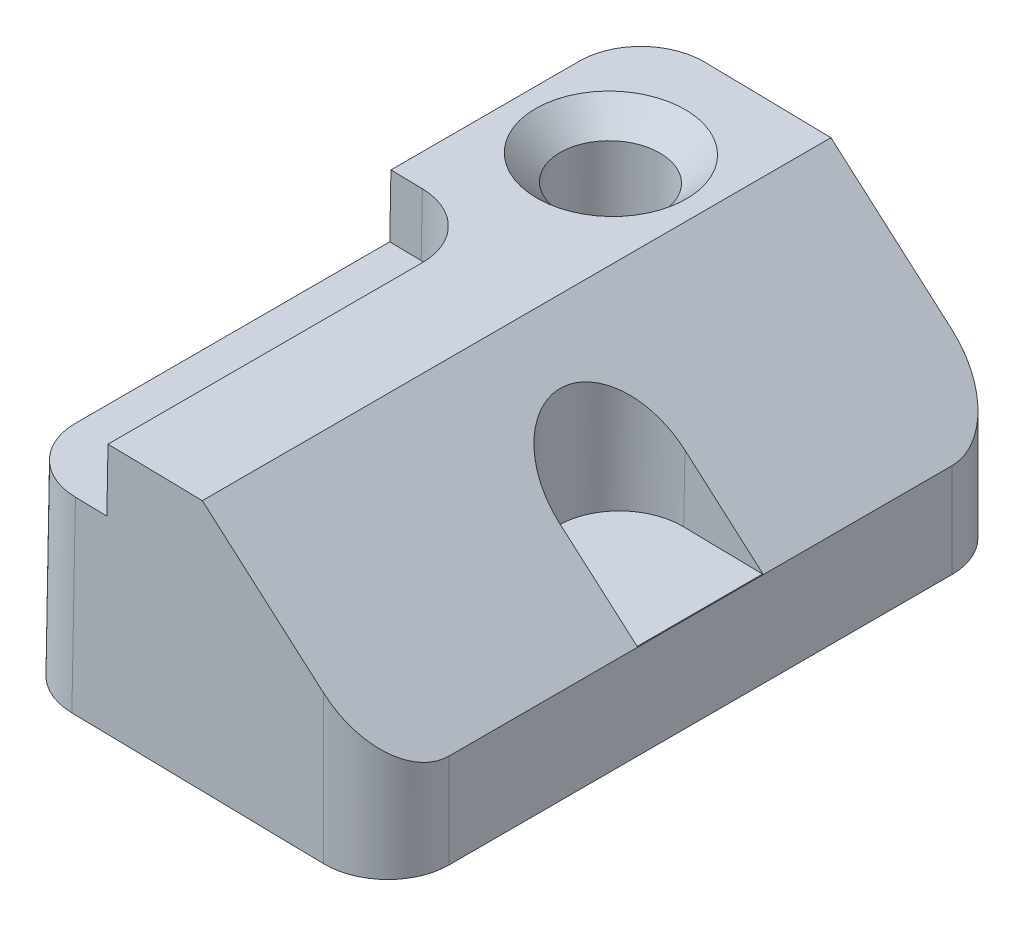
ISO-10303-21;
HEADER;
FILE_DESCRIPTION(('STEP AP214'),'2;1');
FILE_NAME('part.step','',(''),(''),'','','');
FILE_SCHEMA(('AUTOMOTIVE_DESIGN { 1 0 10303 214 1 1 1 1 }'));
ENDSEC;
DATA;
#1=APPLICATION_CONTEXT('core data for automotive mechanical design processes');
#2=APPLICATION_PROTOCOL_DEFINITION('international standard','automotive_design',2000,#1);
#3=PRODUCT_CONTEXT('',#1,'mechanical');
#4=PRODUCT('Part','Part','',(#3));
#5=PRODUCT_RELATED_PRODUCT_CATEGORY('part','',(#4));
#6=PRODUCT_DEFINITION_FORMATION('','',#4);
#7=PRODUCT_DEFINITION_CONTEXT('part definition',#1,'design');
#8=PRODUCT_DEFINITION('design','',#6,#7);
#9=PRODUCT_DEFINITION_SHAPE('','',#8);
#10=(LENGTH_UNIT() NAMED_UNIT(*) SI_UNIT(.MILLI.,.METRE.));
#11=(NAMED_UNIT(*) PLANE_ANGLE_UNIT() SI_UNIT($,.RADIAN.));
#12=(NAMED_UNIT(*) SI_UNIT($,.STERADIAN.) SOLID_ANGLE_UNIT());
#13=UNCERTAINTY_MEASURE_WITH_UNIT(LENGTH_MEASURE(1.E-05),#10,'distance_accuracy_value','');
#14=(GEOMETRIC_REPRESENTATION_CONTEXT(3) GLOBAL_UNCERTAINTY_ASSIGNED_CONTEXT((#13)) GLOBAL_UNIT_ASSIGNED_CONTEXT((#10,
#11,#12)) REPRESENTATION_CONTEXT('',''));
#15=CARTESIAN_POINT('',(0.,0.,0.));
#16=DIRECTION('',(0.,0.,1.));
#17=DIRECTION('',(1.,0.,0.));
#18=AXIS2_PLACEMENT_3D('',#15,#16,#17);
#19=CARTESIAN_POINT('',(76.2,-1.43232934943316,127.));
#20=DIRECTION('',(0.0187936532378794,0.999823383702329,0.));
#21=DIRECTION('',(-0.999823383702329,0.0187936532378794,0.));
#22=AXIS2_PLACEMENT_3D('',#19,#20,#21);
#23=PLANE('',#22);
#24=CARTESIAN_POINT('',(19.0466354595294,-0.358019094181603,25.4));
#25=DIRECTION('',(0.0187936532378794,0.999823383702329,0.));
#26=DIRECTION('',(-0.999823383702329,0.0187936532378794,0.));
#27=AXIS2_PLACEMENT_3D('',#24,#25,#26);
#28=CIRCLE('',#27,10.16);
#29=CARTESIAN_POINT('',(8.88842988111371,-0.167075577284748,25.4));
#30=VERTEX_POINT('',#29);
#31=EDGE_CURVE('E227',#30,#30,#28,.T.);
#32=ORIENTED_EDGE('',*,*,#31,.T.);
#33=EDGE_LOOP('',(#32));
#34=FACE_BOUND('',#33,.T.);
#35=DIRECTION('',(0.999823383702329,-0.0187936532378794,0.));
#36=VECTOR('',#35,1.);
#37=CARTESIAN_POINT('',(76.2,-1.43232934943316,0.));
#38=LINE('',#37,#36);
#39=CARTESIAN_POINT('',(12.6977569730196,-0.238679396121069,0.));
#40=VERTEX_POINT('',#39);
#41=CARTESIAN_POINT('',(63.5,-1.1936077911943,0.));
#42=VERTEX_POINT('',#41);
#43=EDGE_CURVE('E233',#40,#42,#38,.T.);
#44=ORIENTED_EDGE('',*,*,#43,.T.);
#45=CARTESIAN_POINT('',(63.5,-1.1936077911943,12.7));
#46=DIRECTION('',(0.0187936532378794,0.999823383702329,0.));
#47=DIRECTION('',(0.999823383702329,-0.0187936532378794,0.));
#48=AXIS2_PLACEMENT_3D('',#45,#46,#47);
#49=ELLIPSE('',#48,12.7022434232055,12.7);
#50=CARTESIAN_POINT('',(76.2,-1.43232934943316,12.7));
#51=VERTEX_POINT('',#50);
#52=EDGE_CURVE('E11',#42,#51,#49,.F.);
#53=ORIENTED_EDGE('',*,*,#52,.T.);
#54=DIRECTION('',(0.,0.,-1.));
#55=VECTOR('',#54,1.);
#56=CARTESIAN_POINT('',(76.2,-1.43232934943316,127.));
#57=LINE('',#56,#55);
#58=CARTESIAN_POINT('',(76.2,-1.43232934943316,114.3));
#59=VERTEX_POINT('',#58);
#60=EDGE_CURVE('E268',#59,#51,#57,.T.);
#61=ORIENTED_EDGE('',*,*,#60,.F.);
#62=CARTESIAN_POINT('',(63.5,-1.1936077911943,114.3));
#63=DIRECTION('',(0.0187936532378794,0.999823383702329,0.));
#64=DIRECTION('',(-0.999823383702329,0.0187936532378794,0.));
#65=AXIS2_PLACEMENT_3D('',#62,#63,#64);
#66=ELLIPSE('',#65,12.7022434232055,12.7);
#67=CARTESIAN_POINT('',(63.5,-1.1936077911943,127.));
#68=VERTEX_POINT('',#67);
#69=EDGE_CURVE('E316',#59,#68,#66,.F.);
#70=ORIENTED_EDGE('',*,*,#69,.T.);
#71=DIRECTION('',(0.999823383702329,-0.0187936532378794,0.));
#72=VECTOR('',#71,1.);
#73=CARTESIAN_POINT('',(76.2,-1.43232934943316,127.));
#74=LINE('',#73,#72);
#75=CARTESIAN_POINT('',(12.6977569730196,-0.238679396121069,127.));
#76=VERTEX_POINT('',#75);
#77=EDGE_CURVE('E234',#76,#68,#74,.T.);
#78=ORIENTED_EDGE('',*,*,#77,.F.);
#79=CARTESIAN_POINT('',(12.6977569730196,-0.238679396121069,114.3));
#80=DIRECTION('',(0.0187936532378794,0.999823383702329,0.));
#81=DIRECTION('',(-0.999823383702329,0.0187936532378794,0.));
#82=AXIS2_PLACEMENT_3D('',#79,#80,#81);
#83=CIRCLE('',#82,12.7);
#84=CARTESIAN_POINT('',(0.,0.,114.3));
#85=VERTEX_POINT('',#84);
#86=EDGE_CURVE('E324',#76,#85,#83,.F.);
#87=ORIENTED_EDGE('',*,*,#86,.T.);
#88=DIRECTION('',(0.,0.,-1.));
#89=VECTOR('',#88,1.);
#90=CARTESIAN_POINT('',(0.,0.,127.));
#91=LINE('',#90,#89);
#92=CARTESIAN_POINT('',(0.,0.,12.7));
#93=VERTEX_POINT('',#92);
#94=EDGE_CURVE('E245',#85,#93,#91,.T.);
#95=ORIENTED_EDGE('',*,*,#94,.T.);
#96=CARTESIAN_POINT('',(12.6977569730196,-0.238679396121069,12.7));
#97=DIRECTION('',(0.0187936532378794,0.999823383702329,0.));
#98=DIRECTION('',(-0.999823383702329,0.0187936532378794,0.));
#99=AXIS2_PLACEMENT_3D('',#96,#97,#98);
#100=CIRCLE('',#99,12.7);
#101=EDGE_CURVE('E337',#93,#40,#100,.F.);
#102=ORIENTED_EDGE('',*,*,#101,.T.);
#103=EDGE_LOOP('',(#44,#53,#61,#70,#78,#87,#95,#102));
#104=FACE_BOUND('',#103,.T.);
#105=ADVANCED_FACE('F39',(#34,#104),#23,.F.);
#106=CARTESIAN_POINT('',(76.2,17.6176706505668,127.));
#107=DIRECTION('',(-1.,0.,0.));
#108=DIRECTION('',(0.,-1.,0.));
#109=AXIS2_PLACEMENT_3D('',#106,#107,#108);
#110=PLANE('',#109);
#111=ORIENTED_EDGE('',*,*,#60,.T.);
#112=DIRECTION('',(0.,1.,0.));
#113=VECTOR('',#112,1.);
#114=CARTESIAN_POINT('',(76.2,17.6176706505668,12.7));
#115=LINE('',#114,#113);
#116=CARTESIAN_POINT('',(76.2,17.6176706505668,12.7));
#117=VERTEX_POINT('',#116);
#118=EDGE_CURVE('E346',#51,#117,#115,.T.);
#119=ORIENTED_EDGE('',*,*,#118,.T.);
#120=DIRECTION('',(0.,0.,-1.));
#121=VECTOR('',#120,1.);
#122=CARTESIAN_POINT('',(76.2,17.6176706505668,127.));
#123=LINE('',#122,#121);
#124=CARTESIAN_POINT('',(76.2,17.6176706505668,114.3));
#125=VERTEX_POINT('',#124);
#126=EDGE_CURVE('E265',#125,#117,#123,.T.);
#127=ORIENTED_EDGE('',*,*,#126,.F.);
#128=DIRECTION('',(0.,1.,0.));
#129=VECTOR('',#128,1.);
#130=CARTESIAN_POINT('',(76.2,17.6176706505668,114.3));
#131=LINE('',#130,#129);
#132=EDGE_CURVE('E313',#125,#59,#131,.F.);
#133=ORIENTED_EDGE('',*,*,#132,.T.);
#134=EDGE_LOOP('',(#111,#119,#127,#133));
#135=FACE_BOUND('',#134,.T.);
#136=ADVANCED_FACE('F355',(#135),#110,.F.);
#137=CARTESIAN_POINT('',(39.0548862329555,50.0838353252834,127.));
#138=DIRECTION('',(-0.658093396966401,-0.75293630598426,0.));
#139=DIRECTION('',(0.75293630598426,-0.658093396966401,0.));
#140=AXIS2_PLACEMENT_3D('',#137,#138,#139);
#141=PLANE('',#140);
#142=DIRECTION('',(0.,0.,1.));
#143=VECTOR('',#142,1.);
#144=CARTESIAN_POINT('',(76.1015992186016,17.7036764706872,127.));
#145=LINE('',#144,#143);
#146=CARTESIAN_POINT('',(76.1015992186016,17.7036764706872,50.8));
#147=VERTEX_POINT('',#146);
#148=CARTESIAN_POINT('',(76.1015992186016,17.7036764706872,76.2));
#149=VERTEX_POINT('',#148);
#150=EDGE_CURVE('E293',#147,#149,#145,.T.);
#151=ORIENTED_EDGE('',*,*,#150,.T.);
#152=DIRECTION('',(-0.75293630598426,0.658093396966401,0.));
#153=VECTOR('',#152,1.);
#154=CARTESIAN_POINT('',(39.0548862329555,50.0838353252834,76.2));
#155=LINE('',#154,#153);
#156=CARTESIAN_POINT('',(60.3554692980906,31.4663600417993,76.2));
#157=VERTEX_POINT('',#156);
#158=EDGE_CURVE('E166',#149,#157,#155,.T.);
#159=ORIENTED_EDGE('',*,*,#158,.T.);
#160=CARTESIAN_POINT('',(60.3554692980906,31.4663600417993,63.5));
#161=DIRECTION('',(-0.658093396966401,-0.75293630598426,0.));
#162=DIRECTION('',(-0.75293630598426,0.658093396966401,0.));
#163=AXIS2_PLACEMENT_3D('',#160,#161,#162);
#164=ELLIPSE('',#163,16.5975905385593,12.7);
#165=CARTESIAN_POINT('',(60.3554692980906,31.4663600417993,50.8));
#166=VERTEX_POINT('',#165);
#167=EDGE_CURVE('E300',#157,#166,#164,.T.);
#168=ORIENTED_EDGE('',*,*,#167,.T.);
#169=DIRECTION('',(0.75293630598426,-0.658093396966401,0.));
#170=VECTOR('',#169,1.);
#171=CARTESIAN_POINT('',(39.0548862329554,50.0838353252835,50.8));
#172=LINE('',#171,#170);
#173=EDGE_CURVE('E296',#166,#147,#172,.T.);
#174=ORIENTED_EDGE('',*,*,#173,.T.);
#175=EDGE_LOOP('',(#151,#159,#168,#174));
#176=FACE_BOUND('',#175,.T.);
#177=ORIENTED_EDGE('',*,*,#126,.T.);
#178=CARTESIAN_POINT('',(63.5,28.7179271729931,12.7));
#179=DIRECTION('',(-0.658093396966401,-0.75293630598426,0.));
#180=DIRECTION('',(0.75293630598426,-0.658093396966401,0.));
#181=AXIS2_PLACEMENT_3D('',#178,#179,#180);
#182=ELLIPSE('',#181,16.867296608042,12.7);
#183=CARTESIAN_POINT('',(63.5,28.7179271729931,0.));
#184=VERTEX_POINT('',#183);
#185=EDGE_CURVE('E62',#117,#184,#182,.F.);
#186=ORIENTED_EDGE('',*,*,#185,.T.);
#187=DIRECTION('',(-0.75293630598426,0.658093396966401,0.));
#188=VECTOR('',#187,1.);
#189=CARTESIAN_POINT('',(39.0548862329555,50.0838353252834,0.));
#190=LINE('',#189,#188);
#191=CARTESIAN_POINT('',(39.0548862329555,50.0838353252834,0.));
#192=VERTEX_POINT('',#191);
#193=EDGE_CURVE('E248',#184,#192,#190,.T.);
#194=ORIENTED_EDGE('',*,*,#193,.T.);
#195=DIRECTION('',(0.,0.,-1.));
#196=VECTOR('',#195,1.);
#197=CARTESIAN_POINT('',(39.0548862329555,50.0838353252834,127.));
#198=LINE('',#197,#196);
#199=CARTESIAN_POINT('',(39.0548862329555,50.0838353252834,127.));
#200=VERTEX_POINT('',#199);
#201=EDGE_CURVE('E261',#200,#192,#198,.T.);
#202=ORIENTED_EDGE('',*,*,#201,.F.);
#203=DIRECTION('',(-0.75293630598426,0.658093396966401,0.));
#204=VECTOR('',#203,1.);
#205=CARTESIAN_POINT('',(39.0548862329555,50.0838353252834,127.));
#206=LINE('',#205,#204);
#207=CARTESIAN_POINT('',(63.5,28.7179271729931,127.));
#208=VERTEX_POINT('',#207);
#209=EDGE_CURVE('E237',#208,#200,#206,.T.);
#210=ORIENTED_EDGE('',*,*,#209,.F.);
#211=CARTESIAN_POINT('',(63.5,28.7179271729931,114.3));
#212=DIRECTION('',(-0.658093396966401,-0.75293630598426,0.));
#213=DIRECTION('',(-0.75293630598426,0.658093396966401,0.));
#214=AXIS2_PLACEMENT_3D('',#211,#212,#213);
#215=ELLIPSE('',#214,16.867296608042,12.7);
#216=EDGE_CURVE('E310',#208,#125,#215,.F.);
#217=ORIENTED_EDGE('',*,*,#216,.T.);
#218=EDGE_LOOP('',(#177,#186,#194,#202,#210,#217));
#219=FACE_BOUND('',#218,.T.);
#220=ADVANCED_FACE('F360',(#176,#219),#141,.F.);
#221=CARTESIAN_POINT('',(0.954886232955447,50.8,127.));
#222=DIRECTION('',(-0.0187936532378795,-0.999823383702329,0.));
#223=DIRECTION('',(0.999823383702329,-0.0187936532378795,0.));
#224=AXIS2_PLACEMENT_3D('',#221,#222,#223);
#225=PLANE('',#224);
#226=CARTESIAN_POINT('',(20.0015216924848,50.4419809058184,25.4));
#227=DIRECTION('',(-0.0187936532378795,-0.999823383702329,0.));
#228=DIRECTION('',(0.999823383702329,-0.0187936532378795,0.));
#229=AXIS2_PLACEMENT_3D('',#226,#227,#228);
#230=CIRCLE('',#229,15.24);
#231=CARTESIAN_POINT('',(4.76421332486135,50.7283961811637,25.4));
#232=VERTEX_POINT('',#231);
#233=EDGE_CURVE('E276',#232,#232,#230,.T.);
#234=ORIENTED_EDGE('',*,*,#233,.T.);
#235=EDGE_LOOP('',(#234));
#236=FACE_BOUND('',#235,.T.);
#237=DIRECTION('',(-0.999823383702329,0.0187936532378795,0.));
#238=VECTOR('',#237,1.);
#239=CARTESIAN_POINT('',(0.954886232955447,50.8,0.));
#240=LINE('',#239,#238);
#241=CARTESIAN_POINT('',(13.652643205975,50.5613206038789,0.));
#242=VERTEX_POINT('',#241);
#243=EDGE_CURVE('E238',#192,#242,#240,.T.);
#244=ORIENTED_EDGE('',*,*,#243,.T.);
#245=CARTESIAN_POINT('',(13.652643205975,50.5613206038789,12.7));
#246=DIRECTION('',(-0.0187936532378795,-0.999823383702329,0.));
#247=DIRECTION('',(0.999823383702329,-0.0187936532378795,0.));
#248=AXIS2_PLACEMENT_3D('',#245,#246,#247);
#249=CIRCLE('',#248,12.7);
#250=CARTESIAN_POINT('',(0.954886232955447,50.8,12.7));
#251=VERTEX_POINT('',#250);
#252=EDGE_CURVE('E343',#242,#251,#249,.F.);
#253=ORIENTED_EDGE('',*,*,#252,.T.);
#254=DIRECTION('',(0.,0.,-1.));
#255=VECTOR('',#254,1.);
#256=CARTESIAN_POINT('',(0.954886232955447,50.8,127.));
#257=LINE('',#256,#255);
#258=CARTESIAN_POINT('',(0.95488623295544,50.8,50.8));
#259=VERTEX_POINT('',#258);
#260=EDGE_CURVE('E257',#259,#251,#257,.T.);
#261=ORIENTED_EDGE('',*,*,#260,.F.);
#262=DIRECTION('',(-0.999823383702329,0.0187936532378793,0.));
#263=VECTOR('',#262,1.);
#264=CARTESIAN_POINT('',(0.95488623295544,50.8,50.8));
#265=LINE('',#264,#263);
#266=CARTESIAN_POINT('',(7.30376471946524,50.6806603019395,50.8));
#267=VERTEX_POINT('',#266);
#268=EDGE_CURVE('E207',#267,#259,#265,.T.);
#269=ORIENTED_EDGE('',*,*,#268,.F.);
#270=CARTESIAN_POINT('',(7.30376471946524,50.6806603019395,63.5));
#271=DIRECTION('',(-0.0187936532378795,-0.999823383702329,0.));
#272=DIRECTION('',(0.999823383702329,-0.0187936532378795,0.));
#273=AXIS2_PLACEMENT_3D('',#270,#271,#272);
#274=CIRCLE('',#273,12.7);
#275=CARTESIAN_POINT('',(20.0015216924848,50.4419809058184,63.5));
#276=VERTEX_POINT('',#275);
#277=EDGE_CURVE('E290',#267,#276,#274,.T.);
#278=ORIENTED_EDGE('',*,*,#277,.T.);
#279=DIRECTION('',(0.,0.,-1.));
#280=VECTOR('',#279,1.);
#281=CARTESIAN_POINT('',(20.0015216924848,50.4419809058184,127.));
#282=LINE('',#281,#280);
#283=CARTESIAN_POINT('',(20.0015216924848,50.4419809058184,127.));
#284=VERTEX_POINT('',#283);
#285=EDGE_CURVE('E195',#284,#276,#282,.T.);
#286=ORIENTED_EDGE('',*,*,#285,.F.);
#287=DIRECTION('',(-0.999823383702329,0.0187936532378795,0.));
#288=VECTOR('',#287,1.);
#289=CARTESIAN_POINT('',(0.954886232955447,50.8,127.));
#290=LINE('',#289,#288);
#291=EDGE_CURVE('E241',#200,#284,#290,.T.);
#292=ORIENTED_EDGE('',*,*,#291,.F.);
#293=ORIENTED_EDGE('',*,*,#201,.T.);
#294=EDGE_LOOP('',(#244,#253,#261,#269,#278,#286,#292,#293));
#295=FACE_BOUND('',#294,.T.);
#296=ADVANCED_FACE('F418',(#236,#295),#225,.F.);
#297=CARTESIAN_POINT('',(0.,0.,127.));
#298=DIRECTION('',(0.999823383702329,-0.0187936532378796,0.));
#299=DIRECTION('',(0.0187936532378796,0.999823383702329,0.));
#300=AXIS2_PLACEMENT_3D('',#297,#298,#299);
#301=PLANE('',#300);
#302=ORIENTED_EDGE('',*,*,#260,.T.);
#303=DIRECTION('',(-0.0187936532378796,-0.999823383702329,0.));
#304=VECTOR('',#303,1.);
#305=CARTESIAN_POINT('',(0.,0.,12.7));
#306=LINE('',#305,#304);
#307=EDGE_CURVE('E333',#251,#93,#306,.T.);
#308=ORIENTED_EDGE('',*,*,#307,.T.);
#309=ORIENTED_EDGE('',*,*,#94,.F.);
#310=DIRECTION('',(-0.0187936532378796,-0.999823383702329,0.));
#311=VECTOR('',#310,1.);
#312=CARTESIAN_POINT('',(0.,0.,114.3));
#313=LINE('',#312,#311);
#314=CARTESIAN_POINT('',(0.716206836834377,38.1022430269805,114.3));
#315=VERTEX_POINT('',#314);
#316=EDGE_CURVE('E327',#85,#315,#313,.F.);
#317=ORIENTED_EDGE('',*,*,#316,.T.);
#318=DIRECTION('',(0.,0.,1.));
#319=VECTOR('',#318,1.);
#320=CARTESIAN_POINT('',(0.716206836834378,38.1022430269805,127.));
#321=LINE('',#320,#319);
#322=CARTESIAN_POINT('',(0.71620683683437,38.1022430269805,50.8));
#323=VERTEX_POINT('',#322);
#324=EDGE_CURVE('E202',#323,#315,#321,.T.);
#325=ORIENTED_EDGE('',*,*,#324,.F.);
#326=DIRECTION('',(0.0187936532378795,0.999823383702329,0.));
#327=VECTOR('',#326,1.);
#328=CARTESIAN_POINT('',(0.71620683683437,38.1022430269805,50.8));
#329=LINE('',#328,#327);
#330=EDGE_CURVE('E223',#323,#259,#329,.T.);
#331=ORIENTED_EDGE('',*,*,#330,.T.);
#332=EDGE_LOOP('',(#302,#308,#309,#317,#325,#331));
#333=FACE_BOUND('',#332,.T.);
#334=ADVANCED_FACE('F427',(#333),#301,.F.);
#335=CARTESIAN_POINT('',(0.,0.,127.));
#336=DIRECTION('',(0.,0.,-1.));
#337=DIRECTION('',(-1.,0.,0.));
#338=AXIS2_PLACEMENT_3D('',#335,#336,#337);
#339=PLANE('',#338);
#340=DIRECTION('',(0.999823383702329,-0.0187936532378793,0.));
#341=VECTOR('',#340,1.);
#342=CARTESIAN_POINT('',(0.716206836834378,38.1022430269805,127.));
#343=LINE('',#342,#341);
#344=CARTESIAN_POINT('',(13.4139638098539,37.8635636308594,127.));
#345=VERTEX_POINT('',#344);
#346=CARTESIAN_POINT('',(19.7628422963637,37.7442239327989,127.));
#347=VERTEX_POINT('',#346);
#348=EDGE_CURVE('E206',#345,#347,#343,.T.);
#349=ORIENTED_EDGE('',*,*,#348,.F.);
#350=DIRECTION('',(-0.0187936532378796,-0.999823383702329,0.));
#351=VECTOR('',#350,1.);
#352=CARTESIAN_POINT('',(12.6977569730196,-0.238679396121071,127.));
#353=LINE('',#352,#351);
#354=EDGE_CURVE('E320',#345,#76,#353,.T.);
#355=ORIENTED_EDGE('',*,*,#354,.T.);
#356=ORIENTED_EDGE('',*,*,#77,.T.);
#357=DIRECTION('',(0.,1.,0.));
#358=VECTOR('',#357,1.);
#359=CARTESIAN_POINT('',(63.5,0.,127.));
#360=LINE('',#359,#358);
#361=EDGE_CURVE('E306',#68,#208,#360,.T.);
#362=ORIENTED_EDGE('',*,*,#361,.T.);
#363=ORIENTED_EDGE('',*,*,#209,.T.);
#364=ORIENTED_EDGE('',*,*,#291,.T.);
#365=DIRECTION('',(0.0187936532378795,0.999823383702329,0.));
#366=VECTOR('',#365,1.);
#367=CARTESIAN_POINT('',(19.7628422963637,37.7442239327989,127.));
#368=LINE('',#367,#366);
#369=EDGE_CURVE('E217',#347,#284,#368,.T.);
#370=ORIENTED_EDGE('',*,*,#369,.F.);
#371=EDGE_LOOP('',(#349,#355,#356,#362,#363,#364,#370));
#372=FACE_BOUND('',#371,.T.);
#373=ADVANCED_FACE('F369',(#372),#339,.F.);
#374=CARTESIAN_POINT('',(0.,0.,0.));
#375=DIRECTION('',(0.,0.,-1.));
#376=DIRECTION('',(-1.,0.,0.));
#377=AXIS2_PLACEMENT_3D('',#374,#375,#376);
#378=PLANE('',#377);
#379=ORIENTED_EDGE('',*,*,#193,.F.);
#380=DIRECTION('',(0.,1.,0.));
#381=VECTOR('',#380,1.);
#382=CARTESIAN_POINT('',(63.5,-1.43232934943317,0.));
#383=LINE('',#382,#381);
#384=EDGE_CURVE('E48',#184,#42,#383,.F.);
#385=ORIENTED_EDGE('',*,*,#384,.T.);
#386=ORIENTED_EDGE('',*,*,#43,.F.);
#387=DIRECTION('',(-0.0187936532378796,-0.999823383702329,0.));
#388=VECTOR('',#387,1.);
#389=CARTESIAN_POINT('',(13.652643205975,50.5613206038789,0.));
#390=LINE('',#389,#388);
#391=EDGE_CURVE('E340',#40,#242,#390,.F.);
#392=ORIENTED_EDGE('',*,*,#391,.T.);
#393=ORIENTED_EDGE('',*,*,#243,.F.);
#394=EDGE_LOOP('',(#379,#385,#386,#392,#393));
#395=FACE_BOUND('',#394,.T.);
#396=ADVANCED_FACE('F431',(#395),#378,.T.);
#397=CARTESIAN_POINT('',(19.019721512695,-1.7898425428804,25.4));
#398=DIRECTION('',(0.0187936532378795,0.999823383702329,0.));
#399=DIRECTION('',(-0.999823383702329,0.0187936532378795,0.));
#400=AXIS2_PLACEMENT_3D('',#397,#398,#399);
#401=CYLINDRICAL_SURFACE('',#400,10.16);
#402=CARTESIAN_POINT('',(19.9060499340364,45.3628781166106,25.4));
#403=DIRECTION('',(-0.0187936532378799,-0.999823383702329,0.));
#404=DIRECTION('',(0.999823383702329,-0.0187936532378799,0.));
#405=AXIS2_PLACEMENT_3D('',#402,#403,#404);
#406=CIRCLE('',#405,10.16);
#407=CARTESIAN_POINT('',(9.74784435562072,45.5538216335075,25.4));
#408=VERTEX_POINT('',#407);
#409=EDGE_CURVE('E272',#408,#408,#406,.F.);
#410=CARTESIAN_POINT('',(9.74784435562072,45.5538216335075,25.4));
#411=CARTESIAN_POINT('',(9.73889212151128,45.0775622875617,25.4));
#412=CARTESIAN_POINT('',(9.72993988740183,44.601302941616,25.4));
#413=CARTESIAN_POINT('',(9.71203541918293,43.6487842497245,25.4));
#414=CARTESIAN_POINT('',(9.70308318507348,43.1725249037787,25.4));
#415=CARTESIAN_POINT('',(9.68517871685459,42.2200062118872,25.4));
#416=CARTESIAN_POINT('',(9.67622648274514,41.7437468659415,25.4));
#417=CARTESIAN_POINT('',(9.65832201452624,40.79122817405,25.4));
#418=CARTESIAN_POINT('',(9.64936978041679,40.3149688281042,25.4));
#419=CARTESIAN_POINT('',(9.6314653121979,39.3624501362127,25.4));
#420=CARTESIAN_POINT('',(9.62251307808845,38.8861907902669,25.4));
#421=CARTESIAN_POINT('',(9.60460860986955,37.9336720983754,25.4));
#422=CARTESIAN_POINT('',(9.59565637576011,37.4574127524297,25.4));
#423=CARTESIAN_POINT('',(9.57775190754121,36.5048940605382,25.4));
#424=CARTESIAN_POINT('',(9.56879967343176,36.0286347145924,25.4));
#425=CARTESIAN_POINT('',(9.55089520521286,35.0761160227009,25.4));
#426=CARTESIAN_POINT('',(9.54194297110342,34.5998566767552,25.4));
#427=CARTESIAN_POINT('',(9.52403850288452,33.6473379848637,25.4));
#428=CARTESIAN_POINT('',(9.51508626877507,33.1710786389179,25.4));
#429=CARTESIAN_POINT('',(9.49718180055618,32.2185599470264,25.4));
#430=CARTESIAN_POINT('',(9.48822956644673,31.7423006010807,25.4));
#431=CARTESIAN_POINT('',(9.47032509822783,30.7897819091892,25.4));
#432=CARTESIAN_POINT('',(9.46137286411838,30.3135225632434,25.4));
#433=CARTESIAN_POINT('',(9.44346839589949,29.3610038713519,25.4));
#434=CARTESIAN_POINT('',(9.43451616179004,28.8847445254061,25.4));
#435=CARTESIAN_POINT('',(9.41661169357114,27.9322258335146,25.4));
#436=CARTESIAN_POINT('',(9.4076594594617,27.4559664875689,25.4));
#437=CARTESIAN_POINT('',(9.3897549912428,26.5034477956774,25.4));
#438=CARTESIAN_POINT('',(9.38080275713335,26.0271884497316,25.4));
#439=CARTESIAN_POINT('',(9.36289828891446,25.0746697578401,25.4));
#440=CARTESIAN_POINT('',(9.35394605480501,24.5984104118944,25.4));
#441=CARTESIAN_POINT('',(9.33604158658611,23.6458917200029,25.4));
#442=CARTESIAN_POINT('',(9.32708935247666,23.1696323740571,25.4));
#443=CARTESIAN_POINT('',(9.30918488425777,22.2171136821656,25.4));
#444=CARTESIAN_POINT('',(9.30023265014832,21.7408543362199,25.4));
#445=CARTESIAN_POINT('',(9.28232818192942,20.7883356443284,25.4));
#446=CARTESIAN_POINT('',(9.27337594781998,20.3120762983826,25.4));
#447=CARTESIAN_POINT('',(9.25547147960108,19.3595576064911,25.4));
#448=CARTESIAN_POINT('',(9.24651924549163,18.8832982605453,25.4));
#449=CARTESIAN_POINT('',(9.22861477727274,17.9307795686538,25.4));
#450=CARTESIAN_POINT('',(9.21966254316329,17.4545202227081,25.4));
#451=CARTESIAN_POINT('',(9.20175807494439,16.5020015308166,25.4));
#452=CARTESIAN_POINT('',(9.19280584083494,16.0257421848708,25.4));
#453=CARTESIAN_POINT('',(9.17490137261605,15.0732234929793,25.4));
#454=CARTESIAN_POINT('',(9.1659491385066,14.5969641470336,25.4));
#455=CARTESIAN_POINT('',(9.1480446702877,13.6444454551421,25.4));
#456=CARTESIAN_POINT('',(9.13909243617825,13.1681861091963,25.4));
#457=CARTESIAN_POINT('',(9.12118796795936,12.2156674173048,25.4));
#458=CARTESIAN_POINT('',(9.11223573384991,11.7394080713591,25.4));
#459=CARTESIAN_POINT('',(9.09433126563101,10.7868893794676,25.4));
#460=CARTESIAN_POINT('',(9.08537903152157,10.3106300335218,25.4));
#461=CARTESIAN_POINT('',(9.06747456330267,9.3581113416303,25.4));
#462=CARTESIAN_POINT('',(9.05852232919322,8.88185199568455,25.4));
#463=CARTESIAN_POINT('',(9.04061786097433,7.92933330379304,25.4));
#464=CARTESIAN_POINT('',(9.03166562686488,7.45307395784729,25.4));
#465=CARTESIAN_POINT('',(9.01376115864598,6.50055526595579,25.4));
#466=CARTESIAN_POINT('',(9.00480892453653,6.02429592001003,25.4));
#467=CARTESIAN_POINT('',(8.98690445631764,5.07177722811853,25.4));
#468=CARTESIAN_POINT('',(8.97795222220819,4.59551788217278,25.4));
#469=CARTESIAN_POINT('',(8.96004775398929,3.64299919028127,25.4));
#470=CARTESIAN_POINT('',(8.95109551987985,3.16673984433552,25.4));
#471=CARTESIAN_POINT('',(8.93319105166095,2.21422115244402,25.4));
#472=CARTESIAN_POINT('',(8.9242388175515,1.73796180649826,25.4));
#473=CARTESIAN_POINT('',(8.9063343493326,0.785443114606759,25.4));
#474=CARTESIAN_POINT('',(8.89738211522316,0.309183768661007,25.4));
#475=CARTESIAN_POINT('',(8.88842988111371,-0.167075577284745,25.4));
#476=B_SPLINE_CURVE_WITH_KNOTS('',3,(#410,#411,#412,#413,#414,#415,#416,#417,#418,#419,#420,
#421,#422,#423,#424,#425,#426,#427,#428,#429,#430,#431,#432,#433,#434,#435,#436,#437,#438,#439,
#440,#441,#442,#443,#444,#445,#446,#447,#448,#449,#450,#451,#452,#453,#454,#455,#456,#457,#458,
#459,#460,#461,#462,#463,#464,#465,#466,#467,#468,#469,#470,#471,#472,#473,#474,#475),
.UNSPECIFIED.,.F.,.F.,(4,2,2,2,2,2,2,2,2,2,2,2,2,2,2,2,2,2,2,2,2,2,2,2,2,2,2,2,2,2,2,2,4),(0.,
1.4290304279007,2.85806085580139,4.28709128370208,5.71612171160277,7.14515213950346,
8.57418256740416,10.0032129953048,11.4322434232055,12.8612738511062,14.2903042790069,
15.7193347069076,17.1483651348083,18.577395562709,20.0064259906097,21.4354564185104,
22.8644868464111,24.2935172743118,25.7225477022125,27.1515781301132,28.5806085580139,
30.0096389859145,31.4386694138152,32.8676998417159,34.2967302696166,35.7257606975173,
37.154791125418,38.5838215533187,40.0128519812194,41.4418824091201,42.8709128370208,
44.2999432649215,45.7289736928222),.UNSPECIFIED.);
#477=EDGE_CURVE('BSEAM393',#408,#30,#476,.T.);
#478=ORIENTED_EDGE('',*,*,#409,.T.);
#479=ORIENTED_EDGE('',*,*,#31,.F.);
#480=ORIENTED_EDGE('',*,*,#477,.T.);
#481=ORIENTED_EDGE('',*,*,#477,.F.);
#482=EDGE_LOOP('',(#478,#480,#479,#481));
#483=FACE_BOUND('',#482,.T.);
#484=ADVANCED_FACE('F393',(#483),#401,.F.);
#485=CARTESIAN_POINT('',(19.9060499340364,45.3628781166106,25.4));
#486=DIRECTION('',(0.0187936532378799,0.999823383702329,0.));
#487=DIRECTION('',(-0.999823383702329,0.0187936532378799,0.));
#488=AXIS2_PLACEMENT_3D('',#485,#486,#487);
#489=CONICAL_SURFACE('',#488,10.16,0.785398163397451);
#490=CARTESIAN_POINT('',(4.76421332486135,50.7283961811637,25.4));
#491=CARTESIAN_POINT('',(4.81612614809843,50.6744943629589,25.4));
#492=CARTESIAN_POINT('',(4.86803897133551,50.6205925447542,25.4));
#493=CARTESIAN_POINT('',(4.97186461780966,50.5127889083447,25.4));
#494=CARTESIAN_POINT('',(5.02377744104673,50.4588870901399,25.4));
#495=CARTESIAN_POINT('',(5.12760308752089,50.3510834537304,25.4));
#496=CARTESIAN_POINT('',(5.17951591075796,50.2971816355257,25.4));
#497=CARTESIAN_POINT('',(5.28334155723212,50.1893779991162,25.4));
#498=CARTESIAN_POINT('',(5.33525438046919,50.1354761809114,25.4));
#499=CARTESIAN_POINT('',(5.43908002694335,50.0276725445019,25.4));
#500=CARTESIAN_POINT('',(5.49099285018043,49.9737707262972,25.4));
#501=CARTESIAN_POINT('',(5.59481849665458,49.8659670898877,25.4));
#502=CARTESIAN_POINT('',(5.64673131989165,49.8120652716829,25.4));
#503=CARTESIAN_POINT('',(5.75055696636581,49.7042616352734,25.4));
#504=CARTESIAN_POINT('',(5.80246978960289,49.6503598170686,25.4));
#505=CARTESIAN_POINT('',(5.90629543607704,49.5425561806591,25.4));
#506=CARTESIAN_POINT('',(5.95820825931411,49.4886543624544,25.4));
#507=CARTESIAN_POINT('',(6.06203390578827,49.3808507260449,25.4));
#508=CARTESIAN_POINT('',(6.11394672902534,49.3269489078401,25.4));
#509=CARTESIAN_POINT('',(6.2177723754995,49.2191452714306,25.4));
#510=CARTESIAN_POINT('',(6.26968519873658,49.1652434532259,25.4));
#511=CARTESIAN_POINT('',(6.37351084521073,49.0574398168164,25.4));
#512=CARTESIAN_POINT('',(6.4254236684478,49.0035379986116,25.4));
#513=CARTESIAN_POINT('',(6.52924931492196,48.8957343622021,25.4));
#514=CARTESIAN_POINT('',(6.58116213815904,48.8418325439974,25.4));
#515=CARTESIAN_POINT('',(6.68498778463319,48.7340289075879,25.4));
#516=CARTESIAN_POINT('',(6.73690060787027,48.6801270893831,25.4));
#517=CARTESIAN_POINT('',(6.84072625434442,48.5723234529736,25.4));
#518=CARTESIAN_POINT('',(6.8926390775815,48.5184216347688,25.4));
#519=CARTESIAN_POINT('',(6.99646472405565,48.4106179983593,25.4));
#520=CARTESIAN_POINT('',(7.04837754729273,48.3567161801546,25.4));
#521=CARTESIAN_POINT('',(7.15220319376688,48.2489125437451,25.4));
#522=CARTESIAN_POINT('',(7.20411601700396,48.1950107255403,25.4));
#523=CARTESIAN_POINT('',(7.30794166347811,48.0872070891308,25.4));
#524=CARTESIAN_POINT('',(7.35985448671519,48.0333052709261,25.4));
#525=CARTESIAN_POINT('',(7.46368013318934,47.9255016345166,25.4));
#526=CARTESIAN_POINT('',(7.51559295642642,47.8715998163118,25.4));
#527=CARTESIAN_POINT('',(7.61941860290057,47.7637961799023,25.4));
#528=CARTESIAN_POINT('',(7.67133142613765,47.7098943616976,25.4));
#529=CARTESIAN_POINT('',(7.7751570726118,47.6020907252881,25.4));
#530=CARTESIAN_POINT('',(7.82706989584888,47.5481889070833,25.4));
#531=CARTESIAN_POINT('',(7.93089554232303,47.4403852706738,25.4));
#532=CARTESIAN_POINT('',(7.98280836556011,47.3864834524691,25.4));
#533=CARTESIAN_POINT('',(8.08663401203426,47.2786798160596,25.4));
#534=CARTESIAN_POINT('',(8.13854683527134,47.2247779978548,25.4));
#535=CARTESIAN_POINT('',(8.24237248174549,47.1169743614453,25.4));
#536=CARTESIAN_POINT('',(8.29428530498257,47.0630725432405,25.4));
#537=CARTESIAN_POINT('',(8.39811095145672,46.955268906831,25.4));
#538=CARTESIAN_POINT('',(8.4500237746938,46.9013670886263,25.4));
#539=CARTESIAN_POINT('',(8.55384942116795,46.7935634522168,25.4));
#540=CARTESIAN_POINT('',(8.60576224440503,46.739661634012,25.4));
#541=CARTESIAN_POINT('',(8.70958789087918,46.6318579976025,25.4));
#542=CARTESIAN_POINT('',(8.76150071411626,46.5779561793978,25.4));
#543=CARTESIAN_POINT('',(8.86532636059041,46.4701525429883,25.4));
#544=CARTESIAN_POINT('',(8.91723918382749,46.4162507247835,25.4));
#545=CARTESIAN_POINT('',(9.02106483030164,46.308447088374,25.4));
#546=CARTESIAN_POINT('',(9.07297765353872,46.2545452701693,25.4));
#547=CARTESIAN_POINT('',(9.17680330001287,46.1467416337598,25.4));
#548=CARTESIAN_POINT('',(9.22871612324995,46.092839815555,25.4));
#549=CARTESIAN_POINT('',(9.33254176972411,45.9850361791455,25.4));
#550=CARTESIAN_POINT('',(9.38445459296118,45.9311343609407,25.4));
#551=CARTESIAN_POINT('',(9.48828023943534,45.8233307245312,25.4));
#552=CARTESIAN_POINT('',(9.54019306267241,45.7694289063265,25.4));
#553=CARTESIAN_POINT('',(9.64401870914656,45.661625269917,25.4));
#554=CARTESIAN_POINT('',(9.69593153238364,45.6077234517122,25.4));
#555=CARTESIAN_POINT('',(9.74784435562072,45.5538216335075,25.4));
#556=B_SPLINE_CURVE_WITH_KNOTS('',3,(#490,#491,#492,#493,#494,#495,#496,#497,#498,#499,#500,
#501,#502,#503,#504,#505,#506,#507,#508,#509,#510,#511,#512,#513,#514,#515,#516,#517,#518,#519,
#520,#521,#522,#523,#524,#525,#526,#527,#528,#529,#530,#531,#532,#533,#534,#535,#536,#537,#538,
#539,#540,#541,#542,#543,#544,#545,#546,#547,#548,#549,#550,#551,#552,#553,#554,#555),
.UNSPECIFIED.,.F.,.F.,(4,2,2,2,2,2,2,2,2,2,2,2,2,2,2,2,2,2,2,2,2,2,2,2,2,2,2,2,2,2,2,2,4),(0.,
0.224506403026719,0.44901280605345,0.673519209080174,0.898025612106905,1.12253201513363,
1.34703841816036,1.57154482118708,1.79605122421381,2.02055762724053,2.24506403026726,
2.46957043329399,2.69407683632072,2.91858323934744,3.14308964237417,3.3675960454009,
3.59210244842762,3.81660885145435,4.04111525448108,4.2656216575078,4.49012806053453,
4.71463446356125,4.93914086658798,5.16364726961471,5.38815367264144,5.61266007566817,
5.83716647869489,6.06167288172162,6.28617928474835,6.51068568777507,6.7351920908018,
6.95969849382853,7.18420489685526),.UNSPECIFIED.);
#557=EDGE_CURVE('BSEAM389',#232,#408,#556,.T.);
#558=ORIENTED_EDGE('',*,*,#233,.F.);
#559=ORIENTED_EDGE('',*,*,#409,.F.);
#560=ORIENTED_EDGE('',*,*,#557,.T.);
#561=ORIENTED_EDGE('',*,*,#557,.F.);
#562=EDGE_LOOP('',(#558,#560,#559,#561));
#563=FACE_BOUND('',#562,.T.);
#564=ADVANCED_FACE('F389',(#563),#489,.F.);
#565=CARTESIAN_POINT('',(0.71620683683437,38.1022430269805,50.8));
#566=DIRECTION('',(0.,0.,-1.));
#567=DIRECTION('',(-1.,0.,0.));
#568=AXIS2_PLACEMENT_3D('',#565,#566,#567);
#569=PLANE('',#568);
#570=DIRECTION('',(-0.999823383702329,0.0187936532378793,0.));
#571=VECTOR('',#570,1.);
#572=CARTESIAN_POINT('',(0.71620683683437,38.1022430269805,50.8));
#573=LINE('',#572,#571);
#574=CARTESIAN_POINT('',(7.06508532334417,37.9829033289199,50.8));
#575=VERTEX_POINT('',#574);
#576=EDGE_CURVE('E214',#575,#323,#573,.T.);
#577=ORIENTED_EDGE('',*,*,#576,.F.);
#578=DIRECTION('',(0.0187936532378795,0.999823383702329,0.));
#579=VECTOR('',#578,1.);
#580=CARTESIAN_POINT('',(7.30376471946524,50.6806603019395,50.8));
#581=LINE('',#580,#579);
#582=EDGE_CURVE('E280',#575,#267,#581,.T.);
#583=ORIENTED_EDGE('',*,*,#582,.T.);
#584=ORIENTED_EDGE('',*,*,#268,.T.);
#585=ORIENTED_EDGE('',*,*,#330,.F.);
#586=EDGE_LOOP('',(#577,#583,#584,#585));
#587=FACE_BOUND('',#586,.T.);
#588=ADVANCED_FACE('F392',(#587),#569,.F.);
#589=CARTESIAN_POINT('',(19.7628422963637,37.7442239327989,127.));
#590=DIRECTION('',(0.999823383702329,-0.0187936532378795,0.));
#591=DIRECTION('',(0.0187936532378795,0.999823383702329,0.));
#592=AXIS2_PLACEMENT_3D('',#589,#590,#591);
#593=PLANE('',#592);
#594=ORIENTED_EDGE('',*,*,#285,.T.);
#595=DIRECTION('',(0.0187936532378795,0.999823383702329,0.));
#596=VECTOR('',#595,1.);
#597=CARTESIAN_POINT('',(19.7628422963637,37.7442239327989,63.5));
#598=LINE('',#597,#596);
#599=CARTESIAN_POINT('',(19.7628422963637,37.7442239327989,63.5));
#600=VERTEX_POINT('',#599);
#601=EDGE_CURVE('E284',#276,#600,#598,.F.);
#602=ORIENTED_EDGE('',*,*,#601,.T.);
#603=DIRECTION('',(0.,0.,-1.));
#604=VECTOR('',#603,1.);
#605=CARTESIAN_POINT('',(19.7628422963637,37.7442239327989,127.));
#606=LINE('',#605,#604);
#607=EDGE_CURVE('E210',#347,#600,#606,.T.);
#608=ORIENTED_EDGE('',*,*,#607,.F.);
#609=ORIENTED_EDGE('',*,*,#369,.T.);
#610=EDGE_LOOP('',(#594,#602,#608,#609));
#611=FACE_BOUND('',#610,.T.);
#612=ADVANCED_FACE('F415',(#611),#593,.F.);
#613=CARTESIAN_POINT('',(0.716206836834362,38.1022430269805,0.));
#614=DIRECTION('',(-0.0187936532378793,-0.999823383702329,0.));
#615=DIRECTION('',(0.999823383702329,-0.0187936532378793,0.));
#616=AXIS2_PLACEMENT_3D('',#613,#614,#615);
#617=PLANE('',#616);
#618=ORIENTED_EDGE('',*,*,#324,.T.);
#619=CARTESIAN_POINT('',(13.4139638098539,37.8635636308594,114.3));
#620=DIRECTION('',(-0.0187936532378793,-0.999823383702329,0.));
#621=DIRECTION('',(0.999823383702329,-0.0187936532378793,0.));
#622=AXIS2_PLACEMENT_3D('',#619,#620,#621);
#623=CIRCLE('',#622,12.7);
#624=EDGE_CURVE('E330',#315,#345,#623,.F.);
#625=ORIENTED_EDGE('',*,*,#624,.T.);
#626=ORIENTED_EDGE('',*,*,#348,.T.);
#627=ORIENTED_EDGE('',*,*,#607,.T.);
#628=CARTESIAN_POINT('',(7.06508532334417,37.9829033289199,63.5));
#629=DIRECTION('',(-0.0187936532378793,-0.999823383702329,0.));
#630=DIRECTION('',(0.999823383702329,-0.0187936532378793,0.));
#631=AXIS2_PLACEMENT_3D('',#628,#629,#630);
#632=CIRCLE('',#631,12.7);
#633=EDGE_CURVE('E287',#600,#575,#632,.F.);
#634=ORIENTED_EDGE('',*,*,#633,.T.);
#635=ORIENTED_EDGE('',*,*,#576,.T.);
#636=EDGE_LOOP('',(#618,#625,#626,#627,#634,#635));
#637=FACE_BOUND('',#636,.T.);
#638=ADVANCED_FACE('F398',(#637),#617,.F.);
#639=CARTESIAN_POINT('',(7.06508532334417,37.9829033289199,63.5));
#640=DIRECTION('',(-0.0187936532378795,-0.999823383702329,0.));
#641=DIRECTION('',(0.999823383702329,-0.0187936532378795,0.));
#642=AXIS2_PLACEMENT_3D('',#639,#640,#641);
#643=CYLINDRICAL_SURFACE('',#642,12.7);
#644=ORIENTED_EDGE('',*,*,#633,.F.);
#645=ORIENTED_EDGE('',*,*,#601,.F.);
#646=ORIENTED_EDGE('',*,*,#277,.F.);
#647=ORIENTED_EDGE('',*,*,#582,.F.);
#648=EDGE_LOOP('',(#644,#645,#646,#647));
#649=FACE_BOUND('',#648,.T.);
#650=ADVANCED_FACE('F395',(#649),#643,.F.);
#651=CARTESIAN_POINT('',(60.1008441098073,17.9202860506013,76.2));
#652=DIRECTION('',(0.,0.,1.));
#653=DIRECTION('',(1.,0.,0.));
#654=AXIS2_PLACEMENT_3D('',#651,#652,#653);
#655=PLANE('',#654);
#656=DIRECTION('',(0.0187936532378795,0.999823383702329,0.));
#657=VECTOR('',#656,1.);
#658=CARTESIAN_POINT('',(76.1000178958119,17.6195500114887,76.2));
#659=LINE('',#658,#657);
#660=CARTESIAN_POINT('',(76.1000178958119,17.6195500114887,76.2));
#661=VERTEX_POINT('',#660);
#662=EDGE_CURVE('E158',#661,#149,#659,.T.);
#663=ORIENTED_EDGE('',*,*,#662,.F.);
#664=DIRECTION('',(0.999823383702329,-0.0187936532378796,0.));
#665=VECTOR('',#664,1.);
#666=CARTESIAN_POINT('',(60.1008441098073,17.9202860506013,76.2));
#667=LINE('',#666,#665);
#668=CARTESIAN_POINT('',(60.1008441098073,17.9202860506013,76.2));
#669=VERTEX_POINT('',#668);
#670=EDGE_CURVE('E163',#669,#661,#667,.T.);
#671=ORIENTED_EDGE('',*,*,#670,.F.);
#672=DIRECTION('',(0.0187936532378795,0.999823383702329,0.));
#673=VECTOR('',#672,1.);
#674=CARTESIAN_POINT('',(60.1008441098073,17.9202860506013,76.2));
#675=LINE('',#674,#673);
#676=EDGE_CURVE('E192',#669,#157,#675,.T.);
#677=ORIENTED_EDGE('',*,*,#676,.T.);
#678=ORIENTED_EDGE('',*,*,#158,.F.);
#679=EDGE_LOOP('',(#663,#671,#677,#678));
#680=FACE_BOUND('',#679,.T.);
#681=ADVANCED_FACE('F160',(#680),#655,.F.);
#682=CARTESIAN_POINT('',(60.1008441098073,17.9202860506013,63.5));
#683=DIRECTION('',(0.0187936532378795,0.999823383702329,0.));
#684=DIRECTION('',(-0.999823383702329,0.0187936532378795,0.));
#685=AXIS2_PLACEMENT_3D('',#682,#683,#684);
#686=CYLINDRICAL_SURFACE('',#685,12.7);
#687=ORIENTED_EDGE('',*,*,#676,.F.);
#688=CARTESIAN_POINT('',(60.1008441098073,17.9202860506013,63.5));
#689=DIRECTION('',(0.0187936532378795,0.999823383702329,0.));
#690=DIRECTION('',(-0.999823383702329,0.0187936532378795,0.));
#691=AXIS2_PLACEMENT_3D('',#688,#689,#690);
#692=CIRCLE('',#691,12.7);
#693=CARTESIAN_POINT('',(60.1008441098073,17.9202860506013,50.8));
#694=VERTEX_POINT('',#693);
#695=EDGE_CURVE('E171',#694,#669,#692,.T.);
#696=ORIENTED_EDGE('',*,*,#695,.F.);
#697=DIRECTION('',(0.0187936532378795,0.999823383702329,0.));
#698=VECTOR('',#697,1.);
#699=CARTESIAN_POINT('',(60.1008441098073,17.9202860506013,50.8));
#700=LINE('',#699,#698);
#701=EDGE_CURVE('E196',#694,#166,#700,.T.);
#702=ORIENTED_EDGE('',*,*,#701,.T.);
#703=ORIENTED_EDGE('',*,*,#167,.F.);
#704=EDGE_LOOP('',(#687,#696,#702,#703));
#705=FACE_BOUND('',#704,.T.);
#706=ADVANCED_FACE('F455',(#705),#686,.F.);
#707=CARTESIAN_POINT('',(76.1000178958119,17.6195500114887,50.8));
#708=DIRECTION('',(0.,0.,-1.));
#709=DIRECTION('',(-1.,0.,0.));
#710=AXIS2_PLACEMENT_3D('',#707,#708,#709);
#711=PLANE('',#710);
#712=ORIENTED_EDGE('',*,*,#701,.F.);
#713=DIRECTION('',(-0.999823383702329,0.0187936532378796,0.));
#714=VECTOR('',#713,1.);
#715=CARTESIAN_POINT('',(76.1000178958119,17.6195500114887,50.8));
#716=LINE('',#715,#714);
#717=CARTESIAN_POINT('',(76.1000178958119,17.6195500114887,50.8));
#718=VERTEX_POINT('',#717);
#719=EDGE_CURVE('E181',#718,#694,#716,.T.);
#720=ORIENTED_EDGE('',*,*,#719,.F.);
#721=DIRECTION('',(0.0187936532378795,0.999823383702329,0.));
#722=VECTOR('',#721,1.);
#723=CARTESIAN_POINT('',(76.1000178958119,17.6195500114887,50.8));
#724=LINE('',#723,#722);
#725=EDGE_CURVE('E170',#718,#147,#724,.T.);
#726=ORIENTED_EDGE('',*,*,#725,.T.);
#727=ORIENTED_EDGE('',*,*,#173,.F.);
#728=EDGE_LOOP('',(#712,#720,#726,#727));
#729=FACE_BOUND('',#728,.T.);
#730=ADVANCED_FACE('F453',(#729),#711,.F.);
#731=CARTESIAN_POINT('',(76.1000178958119,17.6195500114887,76.2));
#732=DIRECTION('',(0.999823383702329,-0.0187936532378795,0.));
#733=DIRECTION('',(0.0187936532378795,0.999823383702329,0.));
#734=AXIS2_PLACEMENT_3D('',#731,#732,#733);
#735=PLANE('',#734);
#736=ORIENTED_EDGE('',*,*,#725,.F.);
#737=DIRECTION('',(0.,0.,-1.));
#738=VECTOR('',#737,1.);
#739=CARTESIAN_POINT('',(76.1000178958119,17.6195500114887,76.2));
#740=LINE('',#739,#738);
#741=EDGE_CURVE('E174',#661,#718,#740,.T.);
#742=ORIENTED_EDGE('',*,*,#741,.F.);
#743=ORIENTED_EDGE('',*,*,#662,.T.);
#744=ORIENTED_EDGE('',*,*,#150,.F.);
#745=EDGE_LOOP('',(#736,#742,#743,#744));
#746=FACE_BOUND('',#745,.T.);
#747=ADVANCED_FACE('F175',(#746),#735,.F.);
#748=CARTESIAN_POINT('',(60.1008441098073,17.9202860506013,63.5));
#749=DIRECTION('',(0.0187936532378795,0.999823383702329,0.));
#750=DIRECTION('',(-0.999823383702329,0.0187936532378795,0.));
#751=AXIS2_PLACEMENT_3D('',#748,#749,#750);
#752=PLANE('',#751);
#753=ORIENTED_EDGE('',*,*,#670,.T.);
#754=ORIENTED_EDGE('',*,*,#741,.T.);
#755=ORIENTED_EDGE('',*,*,#719,.T.);
#756=ORIENTED_EDGE('',*,*,#695,.T.);
#757=EDGE_LOOP('',(#753,#754,#755,#756));
#758=FACE_BOUND('',#757,.T.);
#759=ADVANCED_FACE('F183',(#758),#752,.T.);
#760=CARTESIAN_POINT('',(63.5,0.,114.3));
#761=DIRECTION('',(0.,1.,0.));
#762=DIRECTION('',(-1.,0.,0.));
#763=AXIS2_PLACEMENT_3D('',#760,#761,#762);
#764=CYLINDRICAL_SURFACE('',#763,12.7);
#765=ORIENTED_EDGE('',*,*,#69,.F.);
#766=ORIENTED_EDGE('',*,*,#132,.F.);
#767=ORIENTED_EDGE('',*,*,#216,.F.);
#768=ORIENTED_EDGE('',*,*,#361,.F.);
#769=EDGE_LOOP('',(#765,#766,#767,#768));
#770=FACE_BOUND('',#769,.T.);
#771=ADVANCED_FACE('F366',(#770),#764,.T.);
#772=CARTESIAN_POINT('',(12.6977569730196,-0.238679396121071,114.3));
#773=DIRECTION('',(-0.0187936532378796,-0.999823383702329,0.));
#774=DIRECTION('',(0.999823383702329,-0.0187936532378796,0.));
#775=AXIS2_PLACEMENT_3D('',#772,#773,#774);
#776=CYLINDRICAL_SURFACE('',#775,12.7);
#777=ORIENTED_EDGE('',*,*,#624,.F.);
#778=ORIENTED_EDGE('',*,*,#316,.F.);
#779=ORIENTED_EDGE('',*,*,#86,.F.);
#780=ORIENTED_EDGE('',*,*,#354,.F.);
#781=EDGE_LOOP('',(#777,#778,#779,#780));
#782=FACE_BOUND('',#781,.T.);
#783=ADVANCED_FACE('F378',(#782),#776,.T.);
#784=CARTESIAN_POINT('',(12.6977569730196,-0.238679396121071,12.7));
#785=DIRECTION('',(0.0187936532378796,0.999823383702329,0.));
#786=DIRECTION('',(-0.999823383702329,0.0187936532378796,0.));
#787=AXIS2_PLACEMENT_3D('',#784,#785,#786);
#788=CYLINDRICAL_SURFACE('',#787,12.7);
#789=ORIENTED_EDGE('',*,*,#252,.F.);
#790=ORIENTED_EDGE('',*,*,#391,.F.);
#791=ORIENTED_EDGE('',*,*,#101,.F.);
#792=ORIENTED_EDGE('',*,*,#307,.F.);
#793=EDGE_LOOP('',(#789,#790,#791,#792));
#794=FACE_BOUND('',#793,.T.);
#795=ADVANCED_FACE('F374',(#794),#788,.T.);
#796=CARTESIAN_POINT('',(63.5,17.6176706505668,12.7));
#797=DIRECTION('',(0.,-1.,0.));
#798=DIRECTION('',(1.,0.,0.));
#799=AXIS2_PLACEMENT_3D('',#796,#797,#798);
#800=CYLINDRICAL_SURFACE('',#799,12.7);
#801=ORIENTED_EDGE('',*,*,#52,.F.);
#802=ORIENTED_EDGE('',*,*,#384,.F.);
#803=ORIENTED_EDGE('',*,*,#185,.F.);
#804=ORIENTED_EDGE('',*,*,#118,.F.);
#805=EDGE_LOOP('',(#801,#802,#803,#804));
#806=FACE_BOUND('',#805,.T.);
#807=ADVANCED_FACE('F41',(#806),#800,.T.);
#808=CLOSED_SHELL('',(#105,#136,#220,#296,#334,#373,#396,#484,#564,#588,#612,#638,#650,#681,
#706,#730,#747,#759,#771,#783,#795,#807));
#809=MANIFOLD_SOLID_BREP('B2',#808);
#810=ADVANCED_BREP_SHAPE_REPRESENTATION('',(#18,#809),#14);
#811=SHAPE_DEFINITION_REPRESENTATION(#9,#810);
ENDSEC;
END-ISO-10303-21;
